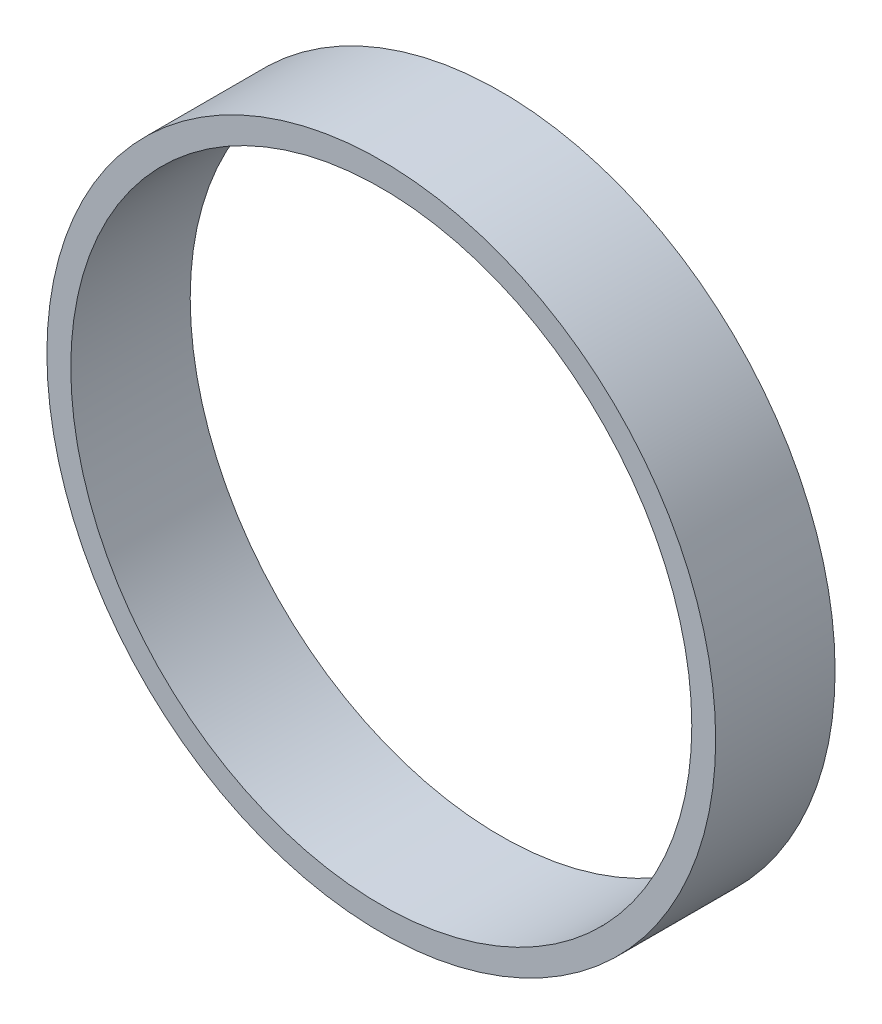
ISO-10303-21;
HEADER;
FILE_DESCRIPTION(('STEP AP214'),'2;1');
FILE_NAME('part.step','',(''),(''),'','','');
FILE_SCHEMA(('AUTOMOTIVE_DESIGN { 1 0 10303 214 1 1 1 1 }'));
ENDSEC;
DATA;
#1=APPLICATION_CONTEXT('core data for automotive mechanical design processes');
#2=APPLICATION_PROTOCOL_DEFINITION('international standard','automotive_design',2000,#1);
#3=PRODUCT_CONTEXT('',#1,'mechanical');
#4=PRODUCT('Part','Part','',(#3));
#5=PRODUCT_RELATED_PRODUCT_CATEGORY('part','',(#4));
#6=PRODUCT_DEFINITION_FORMATION('','',#4);
#7=PRODUCT_DEFINITION_CONTEXT('part definition',#1,'design');
#8=PRODUCT_DEFINITION('design','',#6,#7);
#9=PRODUCT_DEFINITION_SHAPE('','',#8);
#10=(LENGTH_UNIT() NAMED_UNIT(*) SI_UNIT(.MILLI.,.METRE.));
#11=(NAMED_UNIT(*) PLANE_ANGLE_UNIT() SI_UNIT($,.RADIAN.));
#12=(NAMED_UNIT(*) SI_UNIT($,.STERADIAN.) SOLID_ANGLE_UNIT());
#13=UNCERTAINTY_MEASURE_WITH_UNIT(LENGTH_MEASURE(1.E-05),#10,'distance_accuracy_value','');
#14=(GEOMETRIC_REPRESENTATION_CONTEXT(3) GLOBAL_UNCERTAINTY_ASSIGNED_CONTEXT((#13)) GLOBAL_UNIT_ASSIGNED_CONTEXT((#10,
#11,#12)) REPRESENTATION_CONTEXT('',''));
#15=CARTESIAN_POINT('',(0.,0.,0.));
#16=DIRECTION('',(0.,0.,1.));
#17=DIRECTION('',(1.,0.,0.));
#18=AXIS2_PLACEMENT_3D('',#15,#16,#17);
#19=CARTESIAN_POINT('',(0.,0.,10.));
#20=DIRECTION('',(0.,0.,1.));
#21=DIRECTION('',(1.,0.,0.));
#22=AXIS2_PLACEMENT_3D('',#19,#20,#21);
#23=PLANE('',#22);
#24=CARTESIAN_POINT('',(0.,0.,10.));
#25=DIRECTION('',(0.,0.,1.));
#26=DIRECTION('',(1.,0.,0.));
#27=AXIS2_PLACEMENT_3D('',#24,#25,#26);
#28=CIRCLE('',#27,28.);
#29=CARTESIAN_POINT('',(28.,0.,10.));
#30=VERTEX_POINT('',#29);
#31=EDGE_CURVE('E10',#30,#30,#28,.T.);
#32=ORIENTED_EDGE('',*,*,#31,.T.);
#33=EDGE_LOOP('',(#32));
#34=FACE_BOUND('',#33,.T.);
#35=CARTESIAN_POINT('',(0.,0.,10.));
#36=DIRECTION('',(0.,0.,1.));
#37=DIRECTION('',(1.,0.,0.));
#38=AXIS2_PLACEMENT_3D('',#35,#36,#37);
#39=CIRCLE('',#38,26.);
#40=CARTESIAN_POINT('',(26.,0.,10.));
#41=VERTEX_POINT('',#40);
#42=EDGE_CURVE('E42',#41,#41,#39,.T.);
#43=ORIENTED_EDGE('',*,*,#42,.F.);
#44=EDGE_LOOP('',(#43));
#45=FACE_BOUND('',#44,.T.);
#46=ADVANCED_FACE('F31',(#34,#45),#23,.T.);
#47=CARTESIAN_POINT('',(0.,0.,0.));
#48=DIRECTION('',(0.,0.,1.));
#49=DIRECTION('',(1.,0.,0.));
#50=AXIS2_PLACEMENT_3D('',#47,#48,#49);
#51=PLANE('',#50);
#52=CARTESIAN_POINT('',(0.,0.,0.));
#53=DIRECTION('',(0.,0.,1.));
#54=DIRECTION('',(1.,0.,0.));
#55=AXIS2_PLACEMENT_3D('',#52,#53,#54);
#56=CIRCLE('',#55,28.);
#57=CARTESIAN_POINT('',(28.,0.,0.));
#58=VERTEX_POINT('',#57);
#59=EDGE_CURVE('E35',#58,#58,#56,.T.);
#60=ORIENTED_EDGE('',*,*,#59,.F.);
#61=EDGE_LOOP('',(#60));
#62=FACE_BOUND('',#61,.T.);
#63=CARTESIAN_POINT('',(0.,0.,0.));
#64=DIRECTION('',(0.,0.,1.));
#65=DIRECTION('',(1.,0.,0.));
#66=AXIS2_PLACEMENT_3D('',#63,#64,#65);
#67=CIRCLE('',#66,26.);
#68=CARTESIAN_POINT('',(26.,0.,0.));
#69=VERTEX_POINT('',#68);
#70=EDGE_CURVE('E44',#69,#69,#67,.T.);
#71=ORIENTED_EDGE('',*,*,#70,.T.);
#72=EDGE_LOOP('',(#71));
#73=FACE_BOUND('',#72,.T.);
#74=ADVANCED_FACE('F54',(#62,#73),#51,.F.);
#75=CARTESIAN_POINT('',(0.,0.,10.));
#76=DIRECTION('',(0.,0.,-1.));
#77=DIRECTION('',(-1.,0.,0.));
#78=AXIS2_PLACEMENT_3D('',#75,#76,#77);
#79=CYLINDRICAL_SURFACE('',#78,28.);
#80=ORIENTED_EDGE('',*,*,#31,.F.);
#81=EDGE_LOOP('',(#80));
#82=FACE_BOUND('',#81,.T.);
#83=ORIENTED_EDGE('',*,*,#59,.T.);
#84=EDGE_LOOP('',(#83));
#85=FACE_BOUND('',#84,.T.);
#86=ADVANCED_FACE('F33',(#82,#85),#79,.T.);
#87=CARTESIAN_POINT('',(0.,0.,10.));
#88=DIRECTION('',(0.,0.,-1.));
#89=DIRECTION('',(-1.,0.,0.));
#90=AXIS2_PLACEMENT_3D('',#87,#88,#89);
#91=CYLINDRICAL_SURFACE('',#90,26.);
#92=ORIENTED_EDGE('',*,*,#42,.T.);
#93=EDGE_LOOP('',(#92));
#94=FACE_BOUND('',#93,.T.);
#95=ORIENTED_EDGE('',*,*,#70,.F.);
#96=EDGE_LOOP('',(#95));
#97=FACE_BOUND('',#96,.T.);
#98=ADVANCED_FACE('F50',(#94,#97),#91,.F.);
#99=CLOSED_SHELL('',(#46,#74,#86,#98));
#100=MANIFOLD_SOLID_BREP('B2',#99);
#101=ADVANCED_BREP_SHAPE_REPRESENTATION('',(#18,#100),#14);
#102=SHAPE_DEFINITION_REPRESENTATION(#9,#101);
ENDSEC;
END-ISO-10303-21;
